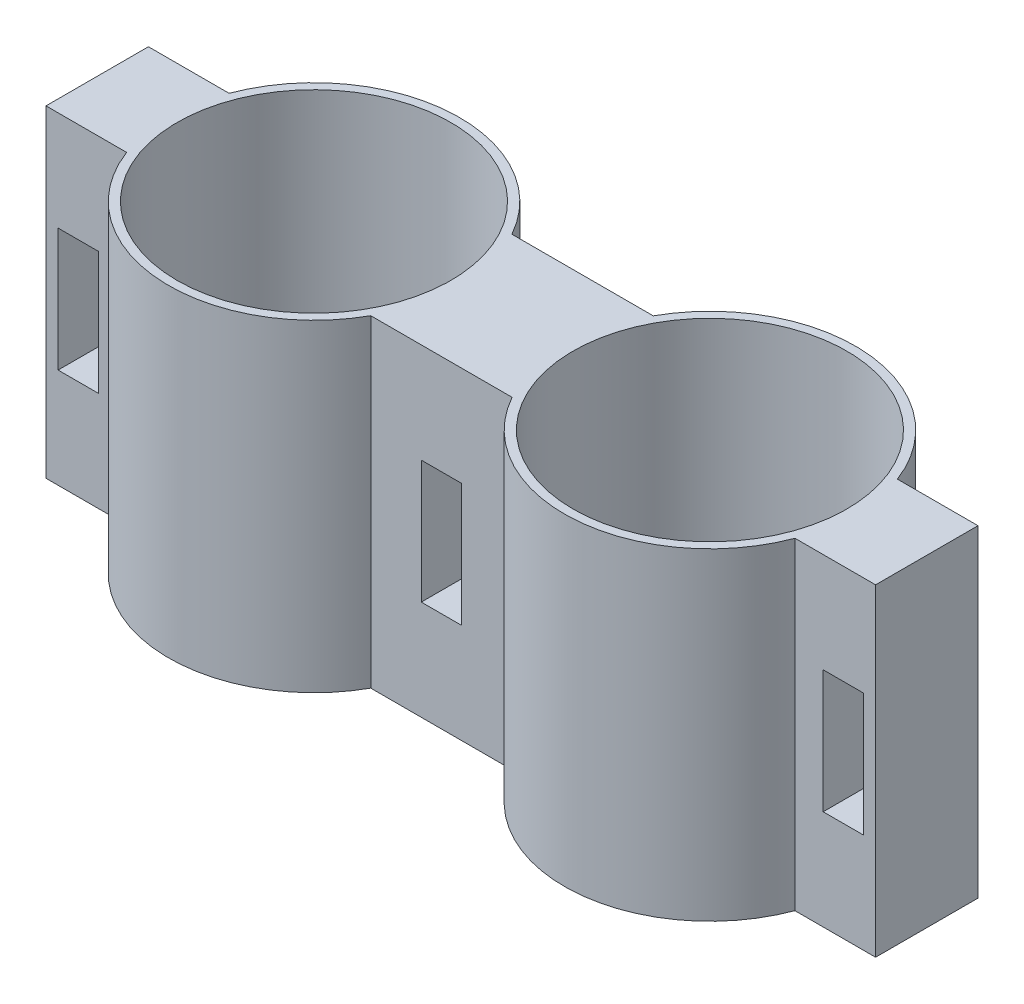
ISO-10303-21;
HEADER;
FILE_DESCRIPTION(('STEP AP214'),'2;1');
FILE_NAME('part.step','',(''),(''),'','','');
FILE_SCHEMA(('AUTOMOTIVE_DESIGN { 1 0 10303 214 1 1 1 1 }'));
ENDSEC;
DATA;
#1=APPLICATION_CONTEXT('core data for automotive mechanical design processes');
#2=APPLICATION_PROTOCOL_DEFINITION('international standard','automotive_design',2000,#1);
#3=PRODUCT_CONTEXT('',#1,'mechanical');
#4=PRODUCT('Part','Part','',(#3));
#5=PRODUCT_RELATED_PRODUCT_CATEGORY('part','',(#4));
#6=PRODUCT_DEFINITION_FORMATION('','',#4);
#7=PRODUCT_DEFINITION_CONTEXT('part definition',#1,'design');
#8=PRODUCT_DEFINITION('design','',#6,#7);
#9=PRODUCT_DEFINITION_SHAPE('','',#8);
#10=(LENGTH_UNIT() NAMED_UNIT(*) SI_UNIT(.MILLI.,.METRE.));
#11=(NAMED_UNIT(*) PLANE_ANGLE_UNIT() SI_UNIT($,.RADIAN.));
#12=(NAMED_UNIT(*) SI_UNIT($,.STERADIAN.) SOLID_ANGLE_UNIT());
#13=UNCERTAINTY_MEASURE_WITH_UNIT(LENGTH_MEASURE(1.E-05),#10,'distance_accuracy_value','');
#14=(GEOMETRIC_REPRESENTATION_CONTEXT(3) GLOBAL_UNCERTAINTY_ASSIGNED_CONTEXT((#13)) GLOBAL_UNIT_ASSIGNED_CONTEXT((#10,
#11,#12)) REPRESENTATION_CONTEXT('',''));
#15=CARTESIAN_POINT('',(0.,0.,0.));
#16=DIRECTION('',(0.,0.,1.));
#17=DIRECTION('',(1.,0.,0.));
#18=AXIS2_PLACEMENT_3D('',#15,#16,#17);
#19=CARTESIAN_POINT('',(49.0921381132429,0.,0.));
#20=DIRECTION('',(0.,1.,0.));
#21=DIRECTION('',(0.,0.,1.));
#22=AXIS2_PLACEMENT_3D('',#19,#20,#21);
#23=PLANE('',#22);
#24=CARTESIAN_POINT('',(-49.1082045229507,0.,0.));
#25=DIRECTION('',(0.,1.,0.));
#26=DIRECTION('',(0.,0.,1.));
#27=AXIS2_PLACEMENT_3D('',#24,#25,#26);
#28=CIRCLE('',#27,33.95);
#29=CARTESIAN_POINT('',(-49.1082045229507,0.,33.95));
#30=VERTEX_POINT('',#29);
#31=EDGE_CURVE('E300',#30,#30,#28,.T.);
#32=ORIENTED_EDGE('',*,*,#31,.T.);
#33=EDGE_LOOP('',(#32));
#34=FACE_BOUND('',#33,.T.);
#35=CARTESIAN_POINT('',(49.0921381132429,0.,0.));
#36=DIRECTION('',(0.,1.,0.));
#37=DIRECTION('',(0.,0.,1.));
#38=AXIS2_PLACEMENT_3D('',#35,#36,#37);
#39=CIRCLE('',#38,33.95);
#40=CARTESIAN_POINT('',(49.0921381132429,0.,33.95));
#41=VERTEX_POINT('',#40);
#42=EDGE_CURVE('E299',#41,#41,#39,.T.);
#43=ORIENTED_EDGE('',*,*,#42,.T.);
#44=EDGE_LOOP('',(#43));
#45=FACE_BOUND('',#44,.T.);
#46=CARTESIAN_POINT('',(49.0921381132429,0.,0.));
#47=DIRECTION('',(0.,1.,0.));
#48=DIRECTION('',(0.,0.,1.));
#49=AXIS2_PLACEMENT_3D('',#46,#47,#48);
#50=CIRCLE('',#49,36.09);
#51=CARTESIAN_POINT('',(82.8737618160787,0.,-12.7));
#52=VERTEX_POINT('',#51);
#53=CARTESIAN_POINT('',(17.5288984189403,0.,-17.5));
#54=VERTEX_POINT('',#53);
#55=EDGE_CURVE('E330',#52,#54,#50,.T.);
#56=ORIENTED_EDGE('',*,*,#55,.F.);
#57=DIRECTION('',(1.,0.,0.));
#58=VECTOR('',#57,1.);
#59=CARTESIAN_POINT('',(82.8737618160788,0.,-12.7));
#60=LINE('',#59,#58);
#61=CARTESIAN_POINT('',(102.873761816079,0.,-12.7));
#62=VERTEX_POINT('',#61);
#63=EDGE_CURVE('E384',#52,#62,#60,.T.);
#64=ORIENTED_EDGE('',*,*,#63,.T.);
#65=DIRECTION('',(0.,0.,-1.));
#66=VECTOR('',#65,1.);
#67=CARTESIAN_POINT('',(102.873761816079,0.,12.7));
#68=LINE('',#67,#66);
#69=CARTESIAN_POINT('',(102.873761816079,0.,12.7));
#70=VERTEX_POINT('',#69);
#71=EDGE_CURVE('E392',#70,#62,#68,.T.);
#72=ORIENTED_EDGE('',*,*,#71,.F.);
#73=DIRECTION('',(1.,0.,0.));
#74=VECTOR('',#73,1.);
#75=CARTESIAN_POINT('',(82.8737618160788,0.,12.7));
#76=LINE('',#75,#74);
#77=CARTESIAN_POINT('',(82.8737618160788,0.,12.6999999999999));
#78=VERTEX_POINT('',#77);
#79=EDGE_CURVE('E303',#78,#70,#76,.T.);
#80=ORIENTED_EDGE('',*,*,#79,.F.);
#81=CARTESIAN_POINT('',(17.5288984189403,0.,17.5));
#82=VERTEX_POINT('',#81);
#83=EDGE_CURVE('E332',#82,#78,#50,.T.);
#84=ORIENTED_EDGE('',*,*,#83,.F.);
#85=DIRECTION('',(1.,0.,0.));
#86=VECTOR('',#85,1.);
#87=CARTESIAN_POINT('',(-17.5288984189403,0.,17.5));
#88=LINE('',#87,#86);
#89=CARTESIAN_POINT('',(-17.5288984189403,0.,17.5));
#90=VERTEX_POINT('',#89);
#91=EDGE_CURVE('E335',#90,#82,#88,.T.);
#92=ORIENTED_EDGE('',*,*,#91,.F.);
#93=CARTESIAN_POINT('',(-49.0921381132429,0.,0.));
#94=DIRECTION('',(0.,1.,0.));
#95=DIRECTION('',(0.,0.,1.));
#96=AXIS2_PLACEMENT_3D('',#93,#94,#95);
#97=CIRCLE('',#96,36.09);
#98=CARTESIAN_POINT('',(-82.8737618160787,0.,12.7));
#99=VERTEX_POINT('',#98);
#100=EDGE_CURVE('E337',#99,#90,#97,.T.);
#101=ORIENTED_EDGE('',*,*,#100,.F.);
#102=DIRECTION('',(-1.,0.,0.));
#103=VECTOR('',#102,1.);
#104=CARTESIAN_POINT('',(-82.8737618160787,0.,12.7));
#105=LINE('',#104,#103);
#106=CARTESIAN_POINT('',(-102.873761816079,0.,12.7));
#107=VERTEX_POINT('',#106);
#108=EDGE_CURVE('E362',#99,#107,#105,.T.);
#109=ORIENTED_EDGE('',*,*,#108,.T.);
#110=DIRECTION('',(0.,0.,-1.));
#111=VECTOR('',#110,1.);
#112=CARTESIAN_POINT('',(-102.873761816079,0.,12.7));
#113=LINE('',#112,#111);
#114=CARTESIAN_POINT('',(-102.873761816079,0.,-12.7));
#115=VERTEX_POINT('',#114);
#116=EDGE_CURVE('E372',#107,#115,#113,.T.);
#117=ORIENTED_EDGE('',*,*,#116,.T.);
#118=DIRECTION('',(-1.,0.,0.));
#119=VECTOR('',#118,1.);
#120=CARTESIAN_POINT('',(-82.8737618160787,0.,-12.7));
#121=LINE('',#120,#119);
#122=CARTESIAN_POINT('',(-82.8737618160787,0.,-12.7));
#123=VERTEX_POINT('',#122);
#124=EDGE_CURVE('E369',#123,#115,#121,.T.);
#125=ORIENTED_EDGE('',*,*,#124,.F.);
#126=CARTESIAN_POINT('',(-17.5288984189403,0.,-17.5));
#127=VERTEX_POINT('',#126);
#128=EDGE_CURVE('E316',#127,#123,#97,.T.);
#129=ORIENTED_EDGE('',*,*,#128,.F.);
#130=DIRECTION('',(1.,0.,0.));
#131=VECTOR('',#130,1.);
#132=CARTESIAN_POINT('',(-17.5288984189403,0.,-17.5));
#133=LINE('',#132,#131);
#134=EDGE_CURVE('E327',#127,#54,#133,.T.);
#135=ORIENTED_EDGE('',*,*,#134,.T.);
#136=EDGE_LOOP('',(#56,#64,#72,#80,#84,#92,#101,#109,#117,#125,#129,#135));
#137=FACE_BOUND('',#136,.T.);
#138=ADVANCED_FACE('F87',(#34,#45,#137),#23,.F.);
#139=CARTESIAN_POINT('',(49.0921381132429,80.,0.));
#140=DIRECTION('',(0.,1.,0.));
#141=DIRECTION('',(0.,0.,1.));
#142=AXIS2_PLACEMENT_3D('',#139,#140,#141);
#143=PLANE('',#142);
#144=CARTESIAN_POINT('',(-49.1082045229507,80.,0.));
#145=DIRECTION('',(0.,1.,0.));
#146=DIRECTION('',(0.,0.,1.));
#147=AXIS2_PLACEMENT_3D('',#144,#145,#146);
#148=CIRCLE('',#147,33.95);
#149=CARTESIAN_POINT('',(-49.1082045229507,80.,33.95));
#150=VERTEX_POINT('',#149);
#151=EDGE_CURVE('E304',#150,#150,#148,.T.);
#152=ORIENTED_EDGE('',*,*,#151,.F.);
#153=EDGE_LOOP('',(#152));
#154=FACE_BOUND('',#153,.T.);
#155=CARTESIAN_POINT('',(49.0921381132429,80.,0.));
#156=DIRECTION('',(0.,1.,0.));
#157=DIRECTION('',(0.,0.,1.));
#158=AXIS2_PLACEMENT_3D('',#155,#156,#157);
#159=CIRCLE('',#158,33.95);
#160=CARTESIAN_POINT('',(49.0921381132429,80.,33.95));
#161=VERTEX_POINT('',#160);
#162=EDGE_CURVE('E307',#161,#161,#159,.T.);
#163=ORIENTED_EDGE('',*,*,#162,.F.);
#164=EDGE_LOOP('',(#163));
#165=FACE_BOUND('',#164,.T.);
#166=CARTESIAN_POINT('',(49.0921381132429,80.,0.));
#167=DIRECTION('',(0.,1.,0.));
#168=DIRECTION('',(0.,0.,1.));
#169=AXIS2_PLACEMENT_3D('',#166,#167,#168);
#170=CIRCLE('',#169,36.09);
#171=CARTESIAN_POINT('',(17.5288984189403,80.,17.5));
#172=VERTEX_POINT('',#171);
#173=CARTESIAN_POINT('',(82.8737618160788,80.,12.6999999999999));
#174=VERTEX_POINT('',#173);
#175=EDGE_CURVE('E317',#172,#174,#170,.T.);
#176=ORIENTED_EDGE('',*,*,#175,.T.);
#177=DIRECTION('',(1.,0.,0.));
#178=VECTOR('',#177,1.);
#179=CARTESIAN_POINT('',(82.8737618160788,80.,12.7));
#180=LINE('',#179,#178);
#181=CARTESIAN_POINT('',(102.873761816079,80.,12.7));
#182=VERTEX_POINT('',#181);
#183=EDGE_CURVE('E380',#174,#182,#180,.T.);
#184=ORIENTED_EDGE('',*,*,#183,.T.);
#185=DIRECTION('',(0.,0.,-1.));
#186=VECTOR('',#185,1.);
#187=CARTESIAN_POINT('',(102.873761816079,80.,12.7));
#188=LINE('',#187,#186);
#189=CARTESIAN_POINT('',(102.873761816079,80.,-12.7));
#190=VERTEX_POINT('',#189);
#191=EDGE_CURVE('E383',#182,#190,#188,.T.);
#192=ORIENTED_EDGE('',*,*,#191,.T.);
#193=DIRECTION('',(1.,0.,0.));
#194=VECTOR('',#193,1.);
#195=CARTESIAN_POINT('',(82.8737618160788,80.,-12.7));
#196=LINE('',#195,#194);
#197=CARTESIAN_POINT('',(82.8737618160788,80.,-12.6999999999999));
#198=VERTEX_POINT('',#197);
#199=EDGE_CURVE('E386',#198,#190,#196,.T.);
#200=ORIENTED_EDGE('',*,*,#199,.F.);
#201=CARTESIAN_POINT('',(17.5288984189403,80.,-17.5));
#202=VERTEX_POINT('',#201);
#203=EDGE_CURVE('E315',#198,#202,#170,.T.);
#204=ORIENTED_EDGE('',*,*,#203,.T.);
#205=DIRECTION('',(1.,0.,0.));
#206=VECTOR('',#205,1.);
#207=CARTESIAN_POINT('',(-17.5288984189403,80.,-17.5));
#208=LINE('',#207,#206);
#209=CARTESIAN_POINT('',(-17.5288984189403,80.,-17.5));
#210=VERTEX_POINT('',#209);
#211=EDGE_CURVE('E312',#210,#202,#208,.T.);
#212=ORIENTED_EDGE('',*,*,#211,.F.);
#213=CARTESIAN_POINT('',(-49.0921381132429,80.,0.));
#214=DIRECTION('',(0.,1.,0.));
#215=DIRECTION('',(0.,0.,1.));
#216=AXIS2_PLACEMENT_3D('',#213,#214,#215);
#217=CIRCLE('',#216,36.09);
#218=CARTESIAN_POINT('',(-82.8737618160787,80.,-12.7));
#219=VERTEX_POINT('',#218);
#220=EDGE_CURVE('E323',#210,#219,#217,.T.);
#221=ORIENTED_EDGE('',*,*,#220,.T.);
#222=DIRECTION('',(-1.,0.,0.));
#223=VECTOR('',#222,1.);
#224=CARTESIAN_POINT('',(-82.8737618160787,80.,-12.7));
#225=LINE('',#224,#223);
#226=CARTESIAN_POINT('',(-102.873761816079,80.,-12.7));
#227=VERTEX_POINT('',#226);
#228=EDGE_CURVE('E359',#219,#227,#225,.T.);
#229=ORIENTED_EDGE('',*,*,#228,.T.);
#230=DIRECTION('',(0.,0.,-1.));
#231=VECTOR('',#230,1.);
#232=CARTESIAN_POINT('',(-102.873761816079,80.,12.7));
#233=LINE('',#232,#231);
#234=CARTESIAN_POINT('',(-102.873761816079,80.,12.7));
#235=VERTEX_POINT('',#234);
#236=EDGE_CURVE('E361',#235,#227,#233,.T.);
#237=ORIENTED_EDGE('',*,*,#236,.F.);
#238=DIRECTION('',(-1.,0.,0.));
#239=VECTOR('',#238,1.);
#240=CARTESIAN_POINT('',(-82.8737618160787,80.,12.7));
#241=LINE('',#240,#239);
#242=CARTESIAN_POINT('',(-82.8737618160787,80.,12.7));
#243=VERTEX_POINT('',#242);
#244=EDGE_CURVE('E365',#243,#235,#241,.T.);
#245=ORIENTED_EDGE('',*,*,#244,.F.);
#246=CARTESIAN_POINT('',(-17.5288984189403,80.,17.5));
#247=VERTEX_POINT('',#246);
#248=EDGE_CURVE('E322',#243,#247,#217,.T.);
#249=ORIENTED_EDGE('',*,*,#248,.T.);
#250=DIRECTION('',(1.,0.,0.));
#251=VECTOR('',#250,1.);
#252=CARTESIAN_POINT('',(-17.5288984189403,80.,17.5));
#253=LINE('',#252,#251);
#254=EDGE_CURVE('E320',#247,#172,#253,.T.);
#255=ORIENTED_EDGE('',*,*,#254,.T.);
#256=EDGE_LOOP('',(#176,#184,#192,#200,#204,#212,#221,#229,#237,#245,#249,#255));
#257=FACE_BOUND('',#256,.T.);
#258=ADVANCED_FACE('F456',(#154,#165,#257),#143,.T.);
#259=CARTESIAN_POINT('',(-17.5288984189403,80.,17.5));
#260=DIRECTION('',(0.,0.,-1.));
#261=DIRECTION('',(-1.,0.,0.));
#262=AXIS2_PLACEMENT_3D('',#259,#260,#261);
#263=PLANE('',#262);
#264=DIRECTION('',(1.,0.,0.));
#265=VECTOR('',#264,1.);
#266=CARTESIAN_POINT('',(-17.5288984189403,55.25,17.5));
#267=LINE('',#266,#265);
#268=CARTESIAN_POINT('',(-4.99999999999999,55.25,17.5));
#269=VERTEX_POINT('',#268);
#270=CARTESIAN_POINT('',(5.00000000000001,55.25,17.5));
#271=VERTEX_POINT('',#270);
#272=EDGE_CURVE('E287',#269,#271,#267,.T.);
#273=ORIENTED_EDGE('',*,*,#272,.T.);
#274=DIRECTION('',(0.,-1.,0.));
#275=VECTOR('',#274,1.);
#276=CARTESIAN_POINT('',(5.00000000000001,80.,17.5));
#277=LINE('',#276,#275);
#278=CARTESIAN_POINT('',(5.00000000000001,24.75,17.5));
#279=VERTEX_POINT('',#278);
#280=EDGE_CURVE('E296',#271,#279,#277,.T.);
#281=ORIENTED_EDGE('',*,*,#280,.T.);
#282=DIRECTION('',(-1.,0.,0.));
#283=VECTOR('',#282,1.);
#284=CARTESIAN_POINT('',(-17.5288984189403,24.75,17.5));
#285=LINE('',#284,#283);
#286=CARTESIAN_POINT('',(-4.99999999999999,24.75,17.5));
#287=VERTEX_POINT('',#286);
#288=EDGE_CURVE('E293',#279,#287,#285,.T.);
#289=ORIENTED_EDGE('',*,*,#288,.T.);
#290=DIRECTION('',(0.,1.,0.));
#291=VECTOR('',#290,1.);
#292=CARTESIAN_POINT('',(-4.99999999999999,80.,17.5));
#293=LINE('',#292,#291);
#294=EDGE_CURVE('E290',#287,#269,#293,.T.);
#295=ORIENTED_EDGE('',*,*,#294,.T.);
#296=EDGE_LOOP('',(#273,#281,#289,#295));
#297=FACE_BOUND('',#296,.T.);
#298=ORIENTED_EDGE('',*,*,#91,.T.);
#299=DIRECTION('',(0.,-1.,0.));
#300=VECTOR('',#299,1.);
#301=CARTESIAN_POINT('',(17.5288984189403,80.,17.5));
#302=LINE('',#301,#300);
#303=EDGE_CURVE('E346',#172,#82,#302,.T.);
#304=ORIENTED_EDGE('',*,*,#303,.F.);
#305=ORIENTED_EDGE('',*,*,#254,.F.);
#306=DIRECTION('',(0.,-1.,0.));
#307=VECTOR('',#306,1.);
#308=CARTESIAN_POINT('',(-17.5288984189403,80.,17.5));
#309=LINE('',#308,#307);
#310=EDGE_CURVE('E343',#247,#90,#309,.T.);
#311=ORIENTED_EDGE('',*,*,#310,.T.);
#312=EDGE_LOOP('',(#298,#304,#305,#311));
#313=FACE_BOUND('',#312,.T.);
#314=ADVANCED_FACE('F452',(#297,#313),#263,.F.);
#315=CARTESIAN_POINT('',(49.0921381132429,80.,0.));
#316=DIRECTION('',(0.,-1.,0.));
#317=DIRECTION('',(0.,0.,-1.));
#318=AXIS2_PLACEMENT_3D('',#315,#316,#317);
#319=CYLINDRICAL_SURFACE('',#318,36.09);
#320=ORIENTED_EDGE('',*,*,#83,.T.);
#321=DIRECTION('',(0.,-1.,0.));
#322=VECTOR('',#321,1.);
#323=CARTESIAN_POINT('',(82.8737618160788,80.,12.6999999999999));
#324=LINE('',#323,#322);
#325=EDGE_CURVE('E342',#78,#174,#324,.F.);
#326=ORIENTED_EDGE('',*,*,#325,.T.);
#327=ORIENTED_EDGE('',*,*,#175,.F.);
#328=ORIENTED_EDGE('',*,*,#303,.T.);
#329=EDGE_LOOP('',(#320,#326,#327,#328));
#330=FACE_BOUND('',#329,.T.);
#331=ADVANCED_FACE('F455',(#330),#319,.T.);
#332=ORIENTED_EDGE('',*,*,#203,.F.);
#333=DIRECTION('',(0.,-1.,0.));
#334=VECTOR('',#333,1.);
#335=CARTESIAN_POINT('',(82.8737618160788,80.,-12.6999999999999));
#336=LINE('',#335,#334);
#337=EDGE_CURVE('E352',#198,#52,#336,.T.);
#338=ORIENTED_EDGE('',*,*,#337,.T.);
#339=ORIENTED_EDGE('',*,*,#55,.T.);
#340=DIRECTION('',(0.,-1.,0.));
#341=VECTOR('',#340,1.);
#342=CARTESIAN_POINT('',(17.5288984189403,80.,-17.5));
#343=LINE('',#342,#341);
#344=EDGE_CURVE('E326',#202,#54,#343,.T.);
#345=ORIENTED_EDGE('',*,*,#344,.F.);
#346=EDGE_LOOP('',(#332,#338,#339,#345));
#347=FACE_BOUND('',#346,.T.);
#348=ADVANCED_FACE('F497',(#347),#319,.T.);
#349=CARTESIAN_POINT('',(-17.5288984189403,80.,-17.5));
#350=DIRECTION('',(0.,0.,-1.));
#351=DIRECTION('',(-1.,0.,0.));
#352=AXIS2_PLACEMENT_3D('',#349,#350,#351);
#353=PLANE('',#352);
#354=DIRECTION('',(0.,-1.,0.));
#355=VECTOR('',#354,1.);
#356=CARTESIAN_POINT('',(5.00000000000001,80.,-17.5));
#357=LINE('',#356,#355);
#358=CARTESIAN_POINT('',(5.00000000000001,55.25,-17.5));
#359=VERTEX_POINT('',#358);
#360=CARTESIAN_POINT('',(5.00000000000001,24.75,-17.5));
#361=VERTEX_POINT('',#360);
#362=EDGE_CURVE('E12',#359,#361,#357,.T.);
#363=ORIENTED_EDGE('',*,*,#362,.F.);
#364=DIRECTION('',(1.,0.,0.));
#365=VECTOR('',#364,1.);
#366=CARTESIAN_POINT('',(-17.5288984189403,55.25,-17.5));
#367=LINE('',#366,#365);
#368=CARTESIAN_POINT('',(-4.99999999999999,55.25,-17.5));
#369=VERTEX_POINT('',#368);
#370=EDGE_CURVE('E420',#369,#359,#367,.T.);
#371=ORIENTED_EDGE('',*,*,#370,.F.);
#372=DIRECTION('',(0.,1.,0.));
#373=VECTOR('',#372,1.);
#374=CARTESIAN_POINT('',(-4.99999999999999,80.,-17.5));
#375=LINE('',#374,#373);
#376=CARTESIAN_POINT('',(-4.99999999999999,24.75,-17.5));
#377=VERTEX_POINT('',#376);
#378=EDGE_CURVE('E422',#377,#369,#375,.T.);
#379=ORIENTED_EDGE('',*,*,#378,.F.);
#380=DIRECTION('',(-1.,0.,0.));
#381=VECTOR('',#380,1.);
#382=CARTESIAN_POINT('',(-17.5288984189403,24.75,-17.5));
#383=LINE('',#382,#381);
#384=EDGE_CURVE('E95',#361,#377,#383,.T.);
#385=ORIENTED_EDGE('',*,*,#384,.F.);
#386=EDGE_LOOP('',(#363,#371,#379,#385));
#387=FACE_BOUND('',#386,.T.);
#388=ORIENTED_EDGE('',*,*,#134,.F.);
#389=DIRECTION('',(0.,-1.,0.));
#390=VECTOR('',#389,1.);
#391=CARTESIAN_POINT('',(-17.5288984189403,80.,-17.5));
#392=LINE('',#391,#390);
#393=EDGE_CURVE('E340',#210,#127,#392,.T.);
#394=ORIENTED_EDGE('',*,*,#393,.F.);
#395=ORIENTED_EDGE('',*,*,#211,.T.);
#396=ORIENTED_EDGE('',*,*,#344,.T.);
#397=EDGE_LOOP('',(#388,#394,#395,#396));
#398=FACE_BOUND('',#397,.T.);
#399=ADVANCED_FACE('F439',(#387,#398),#353,.T.);
#400=CARTESIAN_POINT('',(-49.0921381132429,80.,0.));
#401=DIRECTION('',(0.,-1.,0.));
#402=DIRECTION('',(0.,0.,-1.));
#403=AXIS2_PLACEMENT_3D('',#400,#401,#402);
#404=CYLINDRICAL_SURFACE('',#403,36.09);
#405=DIRECTION('',(0.,-1.,0.));
#406=VECTOR('',#405,1.);
#407=CARTESIAN_POINT('',(-82.8737618160787,80.,-12.7));
#408=LINE('',#407,#406);
#409=EDGE_CURVE('E356',#219,#123,#408,.T.);
#410=ORIENTED_EDGE('',*,*,#409,.F.);
#411=ORIENTED_EDGE('',*,*,#220,.F.);
#412=ORIENTED_EDGE('',*,*,#393,.T.);
#413=ORIENTED_EDGE('',*,*,#128,.T.);
#414=EDGE_LOOP('',(#410,#411,#412,#413));
#415=FACE_BOUND('',#414,.T.);
#416=ADVANCED_FACE('F490',(#415),#404,.T.);
#417=DIRECTION('',(0.,-1.,0.));
#418=VECTOR('',#417,1.);
#419=CARTESIAN_POINT('',(-82.8737618160787,80.,12.7));
#420=LINE('',#419,#418);
#421=EDGE_CURVE('E354',#99,#243,#420,.F.);
#422=ORIENTED_EDGE('',*,*,#421,.F.);
#423=ORIENTED_EDGE('',*,*,#100,.T.);
#424=ORIENTED_EDGE('',*,*,#310,.F.);
#425=ORIENTED_EDGE('',*,*,#248,.F.);
#426=EDGE_LOOP('',(#422,#423,#424,#425));
#427=FACE_BOUND('',#426,.T.);
#428=ADVANCED_FACE('F477',(#427),#404,.T.);
#429=CARTESIAN_POINT('',(102.873761816079,80.,12.7));
#430=DIRECTION('',(-1.,0.,0.));
#431=DIRECTION('',(0.,0.,1.));
#432=AXIS2_PLACEMENT_3D('',#429,#430,#431);
#433=PLANE('',#432);
#434=ORIENTED_EDGE('',*,*,#71,.T.);
#435=DIRECTION('',(0.,-1.,0.));
#436=VECTOR('',#435,1.);
#437=CARTESIAN_POINT('',(102.873761816079,80.,-12.7));
#438=LINE('',#437,#436);
#439=EDGE_CURVE('E389',#190,#62,#438,.T.);
#440=ORIENTED_EDGE('',*,*,#439,.F.);
#441=ORIENTED_EDGE('',*,*,#191,.F.);
#442=DIRECTION('',(0.,-1.,0.));
#443=VECTOR('',#442,1.);
#444=CARTESIAN_POINT('',(102.873761816079,80.,12.7));
#445=LINE('',#444,#443);
#446=EDGE_CURVE('E373',#182,#70,#445,.T.);
#447=ORIENTED_EDGE('',*,*,#446,.T.);
#448=EDGE_LOOP('',(#434,#440,#441,#447));
#449=FACE_BOUND('',#448,.T.);
#450=ADVANCED_FACE('F503',(#449),#433,.F.);
#451=CARTESIAN_POINT('',(82.8737618160788,80.,-12.7));
#452=DIRECTION('',(0.,0.,-1.));
#453=DIRECTION('',(-1.,0.,0.));
#454=AXIS2_PLACEMENT_3D('',#451,#452,#453);
#455=PLANE('',#454);
#456=DIRECTION('',(0.,-1.,0.));
#457=VECTOR('',#456,1.);
#458=CARTESIAN_POINT('',(99.8737618160788,80.,-12.7));
#459=LINE('',#458,#457);
#460=CARTESIAN_POINT('',(99.8737618160788,55.25,-12.7));
#461=VERTEX_POINT('',#460);
#462=CARTESIAN_POINT('',(99.8737618160787,24.75,-12.7));
#463=VERTEX_POINT('',#462);
#464=EDGE_CURVE('E285',#461,#463,#459,.T.);
#465=ORIENTED_EDGE('',*,*,#464,.F.);
#466=DIRECTION('',(1.,0.,0.));
#467=VECTOR('',#466,1.);
#468=CARTESIAN_POINT('',(82.8737618160788,55.25,-12.7));
#469=LINE('',#468,#467);
#470=CARTESIAN_POINT('',(89.8737618160788,55.25,-12.7));
#471=VERTEX_POINT('',#470);
#472=EDGE_CURVE('E278',#471,#461,#469,.T.);
#473=ORIENTED_EDGE('',*,*,#472,.F.);
#474=DIRECTION('',(0.,1.,0.));
#475=VECTOR('',#474,1.);
#476=CARTESIAN_POINT('',(89.8737618160788,80.,-12.7));
#477=LINE('',#476,#475);
#478=CARTESIAN_POINT('',(89.8737618160787,24.75,-12.7));
#479=VERTEX_POINT('',#478);
#480=EDGE_CURVE('E280',#479,#471,#477,.T.);
#481=ORIENTED_EDGE('',*,*,#480,.F.);
#482=DIRECTION('',(-1.,0.,0.));
#483=VECTOR('',#482,1.);
#484=CARTESIAN_POINT('',(82.8737618160787,24.75,-12.7));
#485=LINE('',#484,#483);
#486=EDGE_CURVE('E283',#463,#479,#485,.T.);
#487=ORIENTED_EDGE('',*,*,#486,.F.);
#488=EDGE_LOOP('',(#465,#473,#481,#487));
#489=FACE_BOUND('',#488,.T.);
#490=ORIENTED_EDGE('',*,*,#63,.F.);
#491=ORIENTED_EDGE('',*,*,#337,.F.);
#492=ORIENTED_EDGE('',*,*,#199,.T.);
#493=ORIENTED_EDGE('',*,*,#439,.T.);
#494=EDGE_LOOP('',(#490,#491,#492,#493));
#495=FACE_BOUND('',#494,.T.);
#496=ADVANCED_FACE('F500',(#489,#495),#455,.T.);
#497=CARTESIAN_POINT('',(82.8737618160788,80.,12.7));
#498=DIRECTION('',(0.,0.,-1.));
#499=DIRECTION('',(-1.,0.,0.));
#500=AXIS2_PLACEMENT_3D('',#497,#498,#499);
#501=PLANE('',#500);
#502=DIRECTION('',(1.,0.,0.));
#503=VECTOR('',#502,1.);
#504=CARTESIAN_POINT('',(82.8737618160788,55.25,12.7));
#505=LINE('',#504,#503);
#506=CARTESIAN_POINT('',(89.8737618160788,55.25,12.7));
#507=VERTEX_POINT('',#506);
#508=CARTESIAN_POINT('',(99.8737618160788,55.25,12.7));
#509=VERTEX_POINT('',#508);
#510=EDGE_CURVE('E408',#507,#509,#505,.T.);
#511=ORIENTED_EDGE('',*,*,#510,.T.);
#512=DIRECTION('',(0.,-1.,0.));
#513=VECTOR('',#512,1.);
#514=CARTESIAN_POINT('',(99.8737618160788,80.,12.7));
#515=LINE('',#514,#513);
#516=CARTESIAN_POINT('',(99.8737618160787,24.75,12.7));
#517=VERTEX_POINT('',#516);
#518=EDGE_CURVE('E417',#509,#517,#515,.T.);
#519=ORIENTED_EDGE('',*,*,#518,.T.);
#520=DIRECTION('',(-1.,0.,0.));
#521=VECTOR('',#520,1.);
#522=CARTESIAN_POINT('',(82.8737618160787,24.75,12.7));
#523=LINE('',#522,#521);
#524=CARTESIAN_POINT('',(89.8737618160787,24.75,12.7));
#525=VERTEX_POINT('',#524);
#526=EDGE_CURVE('E414',#517,#525,#523,.T.);
#527=ORIENTED_EDGE('',*,*,#526,.T.);
#528=DIRECTION('',(0.,1.,0.));
#529=VECTOR('',#528,1.);
#530=CARTESIAN_POINT('',(89.8737618160788,80.,12.7));
#531=LINE('',#530,#529);
#532=EDGE_CURVE('E411',#525,#507,#531,.T.);
#533=ORIENTED_EDGE('',*,*,#532,.T.);
#534=EDGE_LOOP('',(#511,#519,#527,#533));
#535=FACE_BOUND('',#534,.T.);
#536=ORIENTED_EDGE('',*,*,#79,.T.);
#537=ORIENTED_EDGE('',*,*,#446,.F.);
#538=ORIENTED_EDGE('',*,*,#183,.F.);
#539=ORIENTED_EDGE('',*,*,#325,.F.);
#540=EDGE_LOOP('',(#536,#537,#538,#539));
#541=FACE_BOUND('',#540,.T.);
#542=ADVANCED_FACE('F89',(#535,#541),#501,.F.);
#543=CARTESIAN_POINT('',(-102.873761816079,80.,12.7));
#544=DIRECTION('',(-1.,0.,0.));
#545=DIRECTION('',(0.,0.,1.));
#546=AXIS2_PLACEMENT_3D('',#543,#544,#545);
#547=PLANE('',#546);
#548=ORIENTED_EDGE('',*,*,#116,.F.);
#549=DIRECTION('',(0.,-1.,0.));
#550=VECTOR('',#549,1.);
#551=CARTESIAN_POINT('',(-102.873761816079,80.,12.7));
#552=LINE('',#551,#550);
#553=EDGE_CURVE('E368',#235,#107,#552,.T.);
#554=ORIENTED_EDGE('',*,*,#553,.F.);
#555=ORIENTED_EDGE('',*,*,#236,.T.);
#556=DIRECTION('',(0.,-1.,0.));
#557=VECTOR('',#556,1.);
#558=CARTESIAN_POINT('',(-102.873761816079,80.,-12.7));
#559=LINE('',#558,#557);
#560=EDGE_CURVE('E331',#227,#115,#559,.T.);
#561=ORIENTED_EDGE('',*,*,#560,.T.);
#562=EDGE_LOOP('',(#548,#554,#555,#561));
#563=FACE_BOUND('',#562,.T.);
#564=ADVANCED_FACE('F482',(#563),#547,.T.);
#565=CARTESIAN_POINT('',(-82.8737618160787,80.,12.7));
#566=DIRECTION('',(0.,0.,1.));
#567=DIRECTION('',(1.,0.,0.));
#568=AXIS2_PLACEMENT_3D('',#565,#566,#567);
#569=PLANE('',#568);
#570=DIRECTION('',(0.,1.,0.));
#571=VECTOR('',#570,1.);
#572=CARTESIAN_POINT('',(-89.8737618160787,80.,12.7));
#573=LINE('',#572,#571);
#574=CARTESIAN_POINT('',(-89.8737618160787,24.75,12.7));
#575=VERTEX_POINT('',#574);
#576=CARTESIAN_POINT('',(-89.8737618160787,55.25,12.7));
#577=VERTEX_POINT('',#576);
#578=EDGE_CURVE('E273',#575,#577,#573,.T.);
#579=ORIENTED_EDGE('',*,*,#578,.F.);
#580=DIRECTION('',(1.,0.,0.));
#581=VECTOR('',#580,1.);
#582=CARTESIAN_POINT('',(-82.8737618160787,24.75,12.7));
#583=LINE('',#582,#581);
#584=CARTESIAN_POINT('',(-99.8737618160787,24.75,12.7));
#585=VERTEX_POINT('',#584);
#586=EDGE_CURVE('E271',#585,#575,#583,.T.);
#587=ORIENTED_EDGE('',*,*,#586,.F.);
#588=DIRECTION('',(0.,-1.,0.));
#589=VECTOR('',#588,1.);
#590=CARTESIAN_POINT('',(-99.8737618160787,80.,12.7));
#591=LINE('',#590,#589);
#592=CARTESIAN_POINT('',(-99.8737618160787,55.25,12.7));
#593=VERTEX_POINT('',#592);
#594=EDGE_CURVE('E256',#593,#585,#591,.T.);
#595=ORIENTED_EDGE('',*,*,#594,.F.);
#596=DIRECTION('',(-1.,0.,0.));
#597=VECTOR('',#596,1.);
#598=CARTESIAN_POINT('',(-82.8737618160787,55.25,12.7));
#599=LINE('',#598,#597);
#600=EDGE_CURVE('E245',#577,#593,#599,.T.);
#601=ORIENTED_EDGE('',*,*,#600,.F.);
#602=EDGE_LOOP('',(#579,#587,#595,#601));
#603=FACE_BOUND('',#602,.T.);
#604=ORIENTED_EDGE('',*,*,#108,.F.);
#605=ORIENTED_EDGE('',*,*,#421,.T.);
#606=ORIENTED_EDGE('',*,*,#244,.T.);
#607=ORIENTED_EDGE('',*,*,#553,.T.);
#608=EDGE_LOOP('',(#604,#605,#606,#607));
#609=FACE_BOUND('',#608,.T.);
#610=ADVANCED_FACE('F269',(#603,#609),#569,.T.);
#611=CARTESIAN_POINT('',(-82.8737618160787,80.,-12.7));
#612=DIRECTION('',(0.,0.,1.));
#613=DIRECTION('',(1.,0.,0.));
#614=AXIS2_PLACEMENT_3D('',#611,#612,#613);
#615=PLANE('',#614);
#616=DIRECTION('',(1.,0.,0.));
#617=VECTOR('',#616,1.);
#618=CARTESIAN_POINT('',(-82.8737618160787,24.75,-12.7));
#619=LINE('',#618,#617);
#620=CARTESIAN_POINT('',(-99.8737618160787,24.75,-12.7));
#621=VERTEX_POINT('',#620);
#622=CARTESIAN_POINT('',(-89.8737618160787,24.75,-12.7));
#623=VERTEX_POINT('',#622);
#624=EDGE_CURVE('E402',#621,#623,#619,.T.);
#625=ORIENTED_EDGE('',*,*,#624,.T.);
#626=DIRECTION('',(0.,1.,0.));
#627=VECTOR('',#626,1.);
#628=CARTESIAN_POINT('',(-89.8737618160787,80.,-12.7));
#629=LINE('',#628,#627);
#630=CARTESIAN_POINT('',(-89.8737618160787,55.25,-12.7));
#631=VERTEX_POINT('',#630);
#632=EDGE_CURVE('E405',#623,#631,#629,.T.);
#633=ORIENTED_EDGE('',*,*,#632,.T.);
#634=DIRECTION('',(-1.,0.,0.));
#635=VECTOR('',#634,1.);
#636=CARTESIAN_POINT('',(-82.8737618160787,55.25,-12.7));
#637=LINE('',#636,#635);
#638=CARTESIAN_POINT('',(-99.8737618160787,55.25,-12.7));
#639=VERTEX_POINT('',#638);
#640=EDGE_CURVE('E358',#631,#639,#637,.T.);
#641=ORIENTED_EDGE('',*,*,#640,.T.);
#642=DIRECTION('',(0.,-1.,0.));
#643=VECTOR('',#642,1.);
#644=CARTESIAN_POINT('',(-99.8737618160787,80.,-12.7));
#645=LINE('',#644,#643);
#646=EDGE_CURVE('E264',#639,#621,#645,.T.);
#647=ORIENTED_EDGE('',*,*,#646,.T.);
#648=EDGE_LOOP('',(#625,#633,#641,#647));
#649=FACE_BOUND('',#648,.T.);
#650=ORIENTED_EDGE('',*,*,#124,.T.);
#651=ORIENTED_EDGE('',*,*,#560,.F.);
#652=ORIENTED_EDGE('',*,*,#228,.F.);
#653=ORIENTED_EDGE('',*,*,#409,.T.);
#654=EDGE_LOOP('',(#650,#651,#652,#653));
#655=FACE_BOUND('',#654,.T.);
#656=ADVANCED_FACE('F486',(#649,#655),#615,.F.);
#657=CARTESIAN_POINT('',(49.0921381132429,0.,0.));
#658=DIRECTION('',(0.,1.,0.));
#659=DIRECTION('',(0.,0.,1.));
#660=AXIS2_PLACEMENT_3D('',#657,#658,#659);
#661=CYLINDRICAL_SURFACE('',#660,33.95);
#662=ORIENTED_EDGE('',*,*,#42,.F.);
#663=EDGE_LOOP('',(#662));
#664=FACE_BOUND('',#663,.T.);
#665=ORIENTED_EDGE('',*,*,#162,.T.);
#666=EDGE_LOOP('',(#665));
#667=FACE_BOUND('',#666,.T.);
#668=ADVANCED_FACE('F523',(#664,#667),#661,.F.);
#669=CARTESIAN_POINT('',(-49.1082045229507,0.,0.));
#670=DIRECTION('',(0.,1.,0.));
#671=DIRECTION('',(0.,0.,1.));
#672=AXIS2_PLACEMENT_3D('',#669,#670,#671);
#673=CYLINDRICAL_SURFACE('',#672,33.95);
#674=ORIENTED_EDGE('',*,*,#31,.F.);
#675=EDGE_LOOP('',(#674));
#676=FACE_BOUND('',#675,.T.);
#677=ORIENTED_EDGE('',*,*,#151,.T.);
#678=EDGE_LOOP('',(#677));
#679=FACE_BOUND('',#678,.T.);
#680=ADVANCED_FACE('F541',(#676,#679),#673,.F.);
#681=CARTESIAN_POINT('',(-89.8737618160787,24.75,-36.09));
#682=DIRECTION('',(1.,0.,0.));
#683=DIRECTION('',(0.,0.,-1.));
#684=AXIS2_PLACEMENT_3D('',#681,#682,#683);
#685=PLANE('',#684);
#686=ORIENTED_EDGE('',*,*,#578,.T.);
#687=DIRECTION('',(0.,0.,1.));
#688=VECTOR('',#687,1.);
#689=CARTESIAN_POINT('',(-89.8737618160787,55.25,-36.09));
#690=LINE('',#689,#688);
#691=EDGE_CURVE('E251',#631,#577,#690,.T.);
#692=ORIENTED_EDGE('',*,*,#691,.F.);
#693=ORIENTED_EDGE('',*,*,#632,.F.);
#694=DIRECTION('',(0.,0.,1.));
#695=VECTOR('',#694,1.);
#696=CARTESIAN_POINT('',(-89.8737618160787,24.75,-36.09));
#697=LINE('',#696,#695);
#698=EDGE_CURVE('E257',#623,#575,#697,.T.);
#699=ORIENTED_EDGE('',*,*,#698,.T.);
#700=EDGE_LOOP('',(#686,#692,#693,#699));
#701=FACE_BOUND('',#700,.T.);
#702=ADVANCED_FACE('F592',(#701),#685,.F.);
#703=CARTESIAN_POINT('',(-99.8737618160787,24.75,-36.09));
#704=DIRECTION('',(0.,-1.,0.));
#705=DIRECTION('',(0.,0.,-1.));
#706=AXIS2_PLACEMENT_3D('',#703,#704,#705);
#707=PLANE('',#706);
#708=ORIENTED_EDGE('',*,*,#586,.T.);
#709=ORIENTED_EDGE('',*,*,#698,.F.);
#710=ORIENTED_EDGE('',*,*,#624,.F.);
#711=DIRECTION('',(0.,0.,1.));
#712=VECTOR('',#711,1.);
#713=CARTESIAN_POINT('',(-99.8737618160787,24.75,-36.09));
#714=LINE('',#713,#712);
#715=EDGE_CURVE('E266',#621,#585,#714,.T.);
#716=ORIENTED_EDGE('',*,*,#715,.T.);
#717=EDGE_LOOP('',(#708,#709,#710,#716));
#718=FACE_BOUND('',#717,.T.);
#719=ADVANCED_FACE('F545',(#718),#707,.F.);
#720=CARTESIAN_POINT('',(-99.8737618160787,24.75,-36.09));
#721=DIRECTION('',(-1.,0.,0.));
#722=DIRECTION('',(0.,0.,1.));
#723=AXIS2_PLACEMENT_3D('',#720,#721,#722);
#724=PLANE('',#723);
#725=ORIENTED_EDGE('',*,*,#594,.T.);
#726=ORIENTED_EDGE('',*,*,#715,.F.);
#727=ORIENTED_EDGE('',*,*,#646,.F.);
#728=DIRECTION('',(0.,0.,1.));
#729=VECTOR('',#728,1.);
#730=CARTESIAN_POINT('',(-99.8737618160787,55.25,-36.09));
#731=LINE('',#730,#729);
#732=EDGE_CURVE('E248',#639,#593,#731,.T.);
#733=ORIENTED_EDGE('',*,*,#732,.T.);
#734=EDGE_LOOP('',(#725,#726,#727,#733));
#735=FACE_BOUND('',#734,.T.);
#736=ADVANCED_FACE('F260',(#735),#724,.F.);
#737=CARTESIAN_POINT('',(-99.8737618160787,55.25,-36.09));
#738=DIRECTION('',(0.,1.,0.));
#739=DIRECTION('',(0.,0.,1.));
#740=AXIS2_PLACEMENT_3D('',#737,#738,#739);
#741=PLANE('',#740);
#742=ORIENTED_EDGE('',*,*,#600,.T.);
#743=ORIENTED_EDGE('',*,*,#732,.F.);
#744=ORIENTED_EDGE('',*,*,#640,.F.);
#745=ORIENTED_EDGE('',*,*,#691,.T.);
#746=EDGE_LOOP('',(#742,#743,#744,#745));
#747=FACE_BOUND('',#746,.T.);
#748=ADVANCED_FACE('F247',(#747),#741,.F.);
#749=CARTESIAN_POINT('',(99.8737618160787,24.75,-36.09));
#750=DIRECTION('',(1.,0.,0.));
#751=DIRECTION('',(0.,1.,0.));
#752=AXIS2_PLACEMENT_3D('',#749,#750,#751);
#753=PLANE('',#752);
#754=ORIENTED_EDGE('',*,*,#464,.T.);
#755=DIRECTION('',(0.,0.,1.));
#756=VECTOR('',#755,1.);
#757=CARTESIAN_POINT('',(99.8737618160787,24.75,-36.09));
#758=LINE('',#757,#756);
#759=EDGE_CURVE('E444',#463,#517,#758,.T.);
#760=ORIENTED_EDGE('',*,*,#759,.T.);
#761=ORIENTED_EDGE('',*,*,#518,.F.);
#762=DIRECTION('',(0.,0.,1.));
#763=VECTOR('',#762,1.);
#764=CARTESIAN_POINT('',(99.8737618160788,55.25,-36.09));
#765=LINE('',#764,#763);
#766=EDGE_CURVE('E551',#461,#509,#765,.T.);
#767=ORIENTED_EDGE('',*,*,#766,.F.);
#768=EDGE_LOOP('',(#754,#760,#761,#767));
#769=FACE_BOUND('',#768,.T.);
#770=ADVANCED_FACE('F566',(#769),#753,.F.);
#771=CARTESIAN_POINT('',(99.8737618160787,24.75,-36.09));
#772=DIRECTION('',(0.,-1.,0.));
#773=DIRECTION('',(1.,0.,0.));
#774=AXIS2_PLACEMENT_3D('',#771,#772,#773);
#775=PLANE('',#774);
#776=ORIENTED_EDGE('',*,*,#486,.T.);
#777=DIRECTION('',(0.,0.,1.));
#778=VECTOR('',#777,1.);
#779=CARTESIAN_POINT('',(89.8737618160787,24.75,-36.09));
#780=LINE('',#779,#778);
#781=EDGE_CURVE('E447',#479,#525,#780,.T.);
#782=ORIENTED_EDGE('',*,*,#781,.T.);
#783=ORIENTED_EDGE('',*,*,#526,.F.);
#784=ORIENTED_EDGE('',*,*,#759,.F.);
#785=EDGE_LOOP('',(#776,#782,#783,#784));
#786=FACE_BOUND('',#785,.T.);
#787=ADVANCED_FACE('F558',(#786),#775,.F.);
#788=CARTESIAN_POINT('',(89.8737618160787,24.75,-36.09));
#789=DIRECTION('',(-1.,0.,0.));
#790=DIRECTION('',(0.,-1.,0.));
#791=AXIS2_PLACEMENT_3D('',#788,#789,#790);
#792=PLANE('',#791);
#793=ORIENTED_EDGE('',*,*,#480,.T.);
#794=DIRECTION('',(0.,0.,1.));
#795=VECTOR('',#794,1.);
#796=CARTESIAN_POINT('',(89.8737618160788,55.25,-36.09));
#797=LINE('',#796,#795);
#798=EDGE_CURVE('E553',#471,#507,#797,.T.);
#799=ORIENTED_EDGE('',*,*,#798,.T.);
#800=ORIENTED_EDGE('',*,*,#532,.F.);
#801=ORIENTED_EDGE('',*,*,#781,.F.);
#802=EDGE_LOOP('',(#793,#799,#800,#801));
#803=FACE_BOUND('',#802,.T.);
#804=ADVANCED_FACE('F569',(#803),#792,.F.);
#805=CARTESIAN_POINT('',(99.8737618160788,55.25,-36.09));
#806=DIRECTION('',(0.,1.,0.));
#807=DIRECTION('',(0.,0.,1.));
#808=AXIS2_PLACEMENT_3D('',#805,#806,#807);
#809=PLANE('',#808);
#810=ORIENTED_EDGE('',*,*,#472,.T.);
#811=ORIENTED_EDGE('',*,*,#766,.T.);
#812=ORIENTED_EDGE('',*,*,#510,.F.);
#813=ORIENTED_EDGE('',*,*,#798,.F.);
#814=EDGE_LOOP('',(#810,#811,#812,#813));
#815=FACE_BOUND('',#814,.T.);
#816=ADVANCED_FACE('F571',(#815),#809,.F.);
#817=CARTESIAN_POINT('',(5.00000000000001,24.75,-36.09));
#818=DIRECTION('',(1.,0.,0.));
#819=DIRECTION('',(0.,0.,-1.));
#820=AXIS2_PLACEMENT_3D('',#817,#818,#819);
#821=PLANE('',#820);
#822=DIRECTION('',(0.,0.,1.));
#823=VECTOR('',#822,1.);
#824=CARTESIAN_POINT('',(5.00000000000001,55.25,-36.09));
#825=LINE('',#824,#823);
#826=EDGE_CURVE('E102',#359,#271,#825,.T.);
#827=ORIENTED_EDGE('',*,*,#826,.F.);
#828=ORIENTED_EDGE('',*,*,#362,.T.);
#829=DIRECTION('',(0.,0.,1.));
#830=VECTOR('',#829,1.);
#831=CARTESIAN_POINT('',(5.00000000000001,24.75,-36.09));
#832=LINE('',#831,#830);
#833=EDGE_CURVE('E431',#361,#279,#832,.T.);
#834=ORIENTED_EDGE('',*,*,#833,.T.);
#835=ORIENTED_EDGE('',*,*,#280,.F.);
#836=EDGE_LOOP('',(#827,#828,#834,#835));
#837=FACE_BOUND('',#836,.T.);
#838=ADVANCED_FACE('F443',(#837),#821,.F.);
#839=CARTESIAN_POINT('',(-4.99999999999999,24.75,-36.09));
#840=DIRECTION('',(0.,-1.,0.));
#841=DIRECTION('',(0.,0.,-1.));
#842=AXIS2_PLACEMENT_3D('',#839,#840,#841);
#843=PLANE('',#842);
#844=ORIENTED_EDGE('',*,*,#833,.F.);
#845=ORIENTED_EDGE('',*,*,#384,.T.);
#846=DIRECTION('',(0.,0.,1.));
#847=VECTOR('',#846,1.);
#848=CARTESIAN_POINT('',(-4.99999999999999,24.75,-36.09));
#849=LINE('',#848,#847);
#850=EDGE_CURVE('E429',#377,#287,#849,.T.);
#851=ORIENTED_EDGE('',*,*,#850,.T.);
#852=ORIENTED_EDGE('',*,*,#288,.F.);
#853=EDGE_LOOP('',(#844,#845,#851,#852));
#854=FACE_BOUND('',#853,.T.);
#855=ADVANCED_FACE('F428',(#854),#843,.F.);
#856=CARTESIAN_POINT('',(-4.99999999999999,24.75,-36.09));
#857=DIRECTION('',(-1.,0.,0.));
#858=DIRECTION('',(0.,0.,1.));
#859=AXIS2_PLACEMENT_3D('',#856,#857,#858);
#860=PLANE('',#859);
#861=ORIENTED_EDGE('',*,*,#850,.F.);
#862=ORIENTED_EDGE('',*,*,#378,.T.);
#863=DIRECTION('',(0.,0.,1.));
#864=VECTOR('',#863,1.);
#865=CARTESIAN_POINT('',(-4.99999999999999,55.25,-36.09));
#866=LINE('',#865,#864);
#867=EDGE_CURVE('E107',#369,#269,#866,.T.);
#868=ORIENTED_EDGE('',*,*,#867,.T.);
#869=ORIENTED_EDGE('',*,*,#294,.F.);
#870=EDGE_LOOP('',(#861,#862,#868,#869));
#871=FACE_BOUND('',#870,.T.);
#872=ADVANCED_FACE('F436',(#871),#860,.F.);
#873=CARTESIAN_POINT('',(-4.99999999999999,55.25,-36.09));
#874=DIRECTION('',(0.,1.,0.));
#875=DIRECTION('',(0.,0.,1.));
#876=AXIS2_PLACEMENT_3D('',#873,#874,#875);
#877=PLANE('',#876);
#878=ORIENTED_EDGE('',*,*,#867,.F.);
#879=ORIENTED_EDGE('',*,*,#370,.T.);
#880=ORIENTED_EDGE('',*,*,#826,.T.);
#881=ORIENTED_EDGE('',*,*,#272,.F.);
#882=EDGE_LOOP('',(#878,#879,#880,#881));
#883=FACE_BOUND('',#882,.T.);
#884=ADVANCED_FACE('F441',(#883),#877,.F.);
#885=CLOSED_SHELL('',(#138,#258,#314,#331,#348,#399,#416,#428,#450,#496,#542,#564,#610,#656,
#668,#680,#702,#719,#736,#748,#770,#787,#804,#816,#838,#855,#872,#884));
#886=MANIFOLD_SOLID_BREP('B2',#885);
#887=ADVANCED_BREP_SHAPE_REPRESENTATION('',(#18,#886),#14);
#888=SHAPE_DEFINITION_REPRESENTATION(#9,#887);
ENDSEC;
END-ISO-10303-21;
